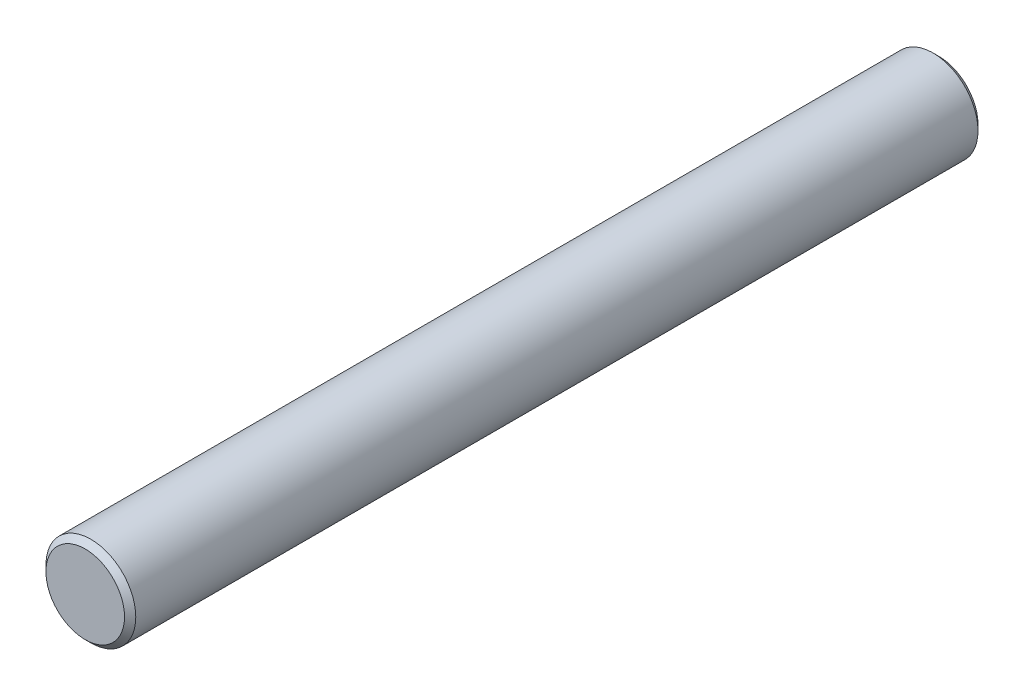
ISO-10303-21;
HEADER;
FILE_DESCRIPTION(('STEP AP214'),'2;1');
FILE_NAME('part.step','',(''),(''),'','','');
FILE_SCHEMA(('AUTOMOTIVE_DESIGN { 1 0 10303 214 1 1 1 1 }'));
ENDSEC;
DATA;
#1=APPLICATION_CONTEXT('core data for automotive mechanical design processes');
#2=APPLICATION_PROTOCOL_DEFINITION('international standard','automotive_design',2000,#1);
#3=PRODUCT_CONTEXT('',#1,'mechanical');
#4=PRODUCT('Part','Part','',(#3));
#5=PRODUCT_RELATED_PRODUCT_CATEGORY('part','',(#4));
#6=PRODUCT_DEFINITION_FORMATION('','',#4);
#7=PRODUCT_DEFINITION_CONTEXT('part definition',#1,'design');
#8=PRODUCT_DEFINITION('design','',#6,#7);
#9=PRODUCT_DEFINITION_SHAPE('','',#8);
#10=(LENGTH_UNIT() NAMED_UNIT(*) SI_UNIT(.MILLI.,.METRE.));
#11=(NAMED_UNIT(*) PLANE_ANGLE_UNIT() SI_UNIT($,.RADIAN.));
#12=(NAMED_UNIT(*) SI_UNIT($,.STERADIAN.) SOLID_ANGLE_UNIT());
#13=UNCERTAINTY_MEASURE_WITH_UNIT(LENGTH_MEASURE(1.E-05),#10,'distance_accuracy_value','');
#14=(GEOMETRIC_REPRESENTATION_CONTEXT(3) GLOBAL_UNCERTAINTY_ASSIGNED_CONTEXT((#13)) GLOBAL_UNIT_ASSIGNED_CONTEXT((#10,
#11,#12)) REPRESENTATION_CONTEXT('',''));
#15=CARTESIAN_POINT('',(0.,0.,0.));
#16=DIRECTION('',(0.,0.,1.));
#17=DIRECTION('',(1.,0.,0.));
#18=AXIS2_PLACEMENT_3D('',#15,#16,#17);
#19=CARTESIAN_POINT('',(0.,0.,76.));
#20=DIRECTION('',(0.,0.,-1.));
#21=DIRECTION('',(-1.,0.,0.));
#22=AXIS2_PLACEMENT_3D('',#19,#20,#21);
#23=CYLINDRICAL_SURFACE('',#22,4.);
#24=CARTESIAN_POINT('',(0.,0.,0.5));
#25=DIRECTION('',(0.,0.,1.));
#26=DIRECTION('',(1.,0.,0.));
#27=AXIS2_PLACEMENT_3D('',#24,#25,#26);
#28=CIRCLE('',#27,4.);
#29=CARTESIAN_POINT('',(4.,0.,0.5));
#30=VERTEX_POINT('',#29);
#31=EDGE_CURVE('E44',#30,#30,#28,.T.);
#32=ORIENTED_EDGE('',*,*,#31,.T.);
#33=EDGE_LOOP('',(#32));
#34=FACE_BOUND('',#33,.T.);
#35=CARTESIAN_POINT('',(0.,0.,75.5));
#36=DIRECTION('',(0.,0.,1.));
#37=DIRECTION('',(1.,0.,0.));
#38=AXIS2_PLACEMENT_3D('',#35,#36,#37);
#39=CIRCLE('',#38,4.);
#40=CARTESIAN_POINT('',(4.,0.,75.5));
#41=VERTEX_POINT('',#40);
#42=EDGE_CURVE('E48',#41,#41,#39,.F.);
#43=ORIENTED_EDGE('',*,*,#42,.T.);
#44=EDGE_LOOP('',(#43));
#45=FACE_BOUND('',#44,.T.);
#46=ADVANCED_FACE('F32',(#34,#45),#23,.T.);
#47=CARTESIAN_POINT('',(0.,0.,76.));
#48=DIRECTION('',(0.,0.,1.));
#49=DIRECTION('',(1.,0.,0.));
#50=AXIS2_PLACEMENT_3D('',#47,#48,#49);
#51=PLANE('',#50);
#52=CARTESIAN_POINT('',(0.,0.,76.));
#53=DIRECTION('',(0.,0.,1.));
#54=DIRECTION('',(1.,0.,0.));
#55=AXIS2_PLACEMENT_3D('',#52,#53,#54);
#56=CIRCLE('',#55,3.5);
#57=CARTESIAN_POINT('',(3.5,0.,76.));
#58=VERTEX_POINT('',#57);
#59=EDGE_CURVE('E10',#58,#58,#56,.T.);
#60=ORIENTED_EDGE('',*,*,#59,.T.);
#61=EDGE_LOOP('',(#60));
#62=FACE_BOUND('',#61,.T.);
#63=ADVANCED_FACE('F64',(#62),#51,.T.);
#64=CARTESIAN_POINT('',(0.,0.,0.));
#65=DIRECTION('',(0.,0.,1.));
#66=DIRECTION('',(1.,0.,0.));
#67=AXIS2_PLACEMENT_3D('',#64,#65,#66);
#68=PLANE('',#67);
#69=CARTESIAN_POINT('',(0.,0.,0.));
#70=DIRECTION('',(0.,0.,1.));
#71=DIRECTION('',(1.,0.,0.));
#72=AXIS2_PLACEMENT_3D('',#69,#70,#71);
#73=CIRCLE('',#72,3.5);
#74=CARTESIAN_POINT('',(3.5,0.,0.));
#75=VERTEX_POINT('',#74);
#76=EDGE_CURVE('E40',#75,#75,#73,.F.);
#77=ORIENTED_EDGE('',*,*,#76,.T.);
#78=EDGE_LOOP('',(#77));
#79=FACE_BOUND('',#78,.T.);
#80=ADVANCED_FACE('F61',(#79),#68,.F.);
#81=CARTESIAN_POINT('',(0.,0.,0.5));
#82=DIRECTION('',(0.,0.,1.));
#83=DIRECTION('',(1.,0.,0.));
#84=AXIS2_PLACEMENT_3D('',#81,#82,#83);
#85=CONICAL_SURFACE('',#84,4.,0.785398163397445);
#86=ORIENTED_EDGE('',*,*,#76,.F.);
#87=EDGE_LOOP('',(#86));
#88=FACE_BOUND('',#87,.T.);
#89=ORIENTED_EDGE('',*,*,#31,.F.);
#90=EDGE_LOOP('',(#89));
#91=FACE_BOUND('',#90,.T.);
#92=ADVANCED_FACE('F57',(#88,#91),#85,.T.);
#93=CARTESIAN_POINT('',(0.,0.,76.));
#94=DIRECTION('',(0.,0.,-1.));
#95=DIRECTION('',(-1.,0.,0.));
#96=AXIS2_PLACEMENT_3D('',#93,#94,#95);
#97=CONICAL_SURFACE('',#96,3.5,0.785398163397452);
#98=ORIENTED_EDGE('',*,*,#42,.F.);
#99=EDGE_LOOP('',(#98));
#100=FACE_BOUND('',#99,.T.);
#101=ORIENTED_EDGE('',*,*,#59,.F.);
#102=EDGE_LOOP('',(#101));
#103=FACE_BOUND('',#102,.T.);
#104=ADVANCED_FACE('F35',(#100,#103),#97,.T.);
#105=CLOSED_SHELL('',(#46,#63,#80,#92,#104));
#106=MANIFOLD_SOLID_BREP('B2',#105);
#107=ADVANCED_BREP_SHAPE_REPRESENTATION('',(#18,#106),#14);
#108=SHAPE_DEFINITION_REPRESENTATION(#9,#107);
ENDSEC;
END-ISO-10303-21;
